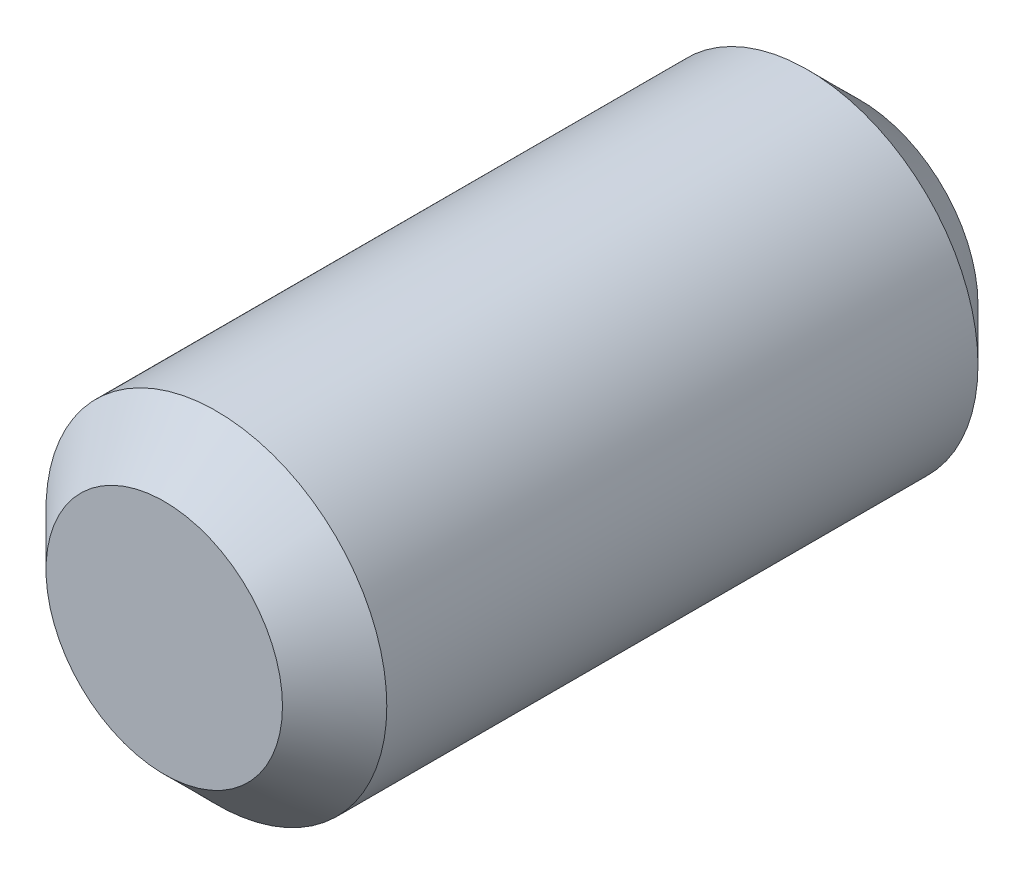
ISO-10303-21;
HEADER;
FILE_DESCRIPTION(('STEP AP214'),'2;1');
FILE_NAME('part.step','',(''),(''),'','','');
FILE_SCHEMA(('AUTOMOTIVE_DESIGN { 1 0 10303 214 1 1 1 1 }'));
ENDSEC;
DATA;
#1=APPLICATION_CONTEXT('core data for automotive mechanical design processes');
#2=APPLICATION_PROTOCOL_DEFINITION('international standard','automotive_design',2000,#1);
#3=PRODUCT_CONTEXT('',#1,'mechanical');
#4=PRODUCT('Part','Part','',(#3));
#5=PRODUCT_RELATED_PRODUCT_CATEGORY('part','',(#4));
#6=PRODUCT_DEFINITION_FORMATION('','',#4);
#7=PRODUCT_DEFINITION_CONTEXT('part definition',#1,'design');
#8=PRODUCT_DEFINITION('design','',#6,#7);
#9=PRODUCT_DEFINITION_SHAPE('','',#8);
#10=(LENGTH_UNIT() NAMED_UNIT(*) SI_UNIT(.MILLI.,.METRE.));
#11=(NAMED_UNIT(*) PLANE_ANGLE_UNIT() SI_UNIT($,.RADIAN.));
#12=(NAMED_UNIT(*) SI_UNIT($,.STERADIAN.) SOLID_ANGLE_UNIT());
#13=UNCERTAINTY_MEASURE_WITH_UNIT(LENGTH_MEASURE(1.E-05),#10,'distance_accuracy_value','');
#14=(GEOMETRIC_REPRESENTATION_CONTEXT(3) GLOBAL_UNCERTAINTY_ASSIGNED_CONTEXT((#13)) GLOBAL_UNIT_ASSIGNED_CONTEXT((#10,
#11,#12)) REPRESENTATION_CONTEXT('',''));
#15=CARTESIAN_POINT('',(0.,0.,0.));
#16=DIRECTION('',(0.,0.,1.));
#17=DIRECTION('',(1.,0.,0.));
#18=AXIS2_PLACEMENT_3D('',#15,#16,#17);
#19=CARTESIAN_POINT('',(0.,0.,10.));
#20=DIRECTION('',(0.,0.,-1.));
#21=DIRECTION('',(-1.,0.,0.));
#22=AXIS2_PLACEMENT_3D('',#19,#20,#21);
#23=CYLINDRICAL_SURFACE('',#22,2.45);
#24=CARTESIAN_POINT('',(0.,0.,9.25));
#25=DIRECTION('',(0.,0.,1.));
#26=DIRECTION('',(1.,0.,0.));
#27=AXIS2_PLACEMENT_3D('',#24,#25,#26);
#28=CIRCLE('',#27,2.45);
#29=CARTESIAN_POINT('',(2.45,0.,9.25));
#30=VERTEX_POINT('',#29);
#31=EDGE_CURVE('E51',#30,#30,#28,.F.);
#32=ORIENTED_EDGE('',*,*,#31,.T.);
#33=EDGE_LOOP('',(#32));
#34=FACE_BOUND('',#33,.T.);
#35=CARTESIAN_POINT('',(0.,0.,0.750000000000001));
#36=DIRECTION('',(0.,0.,1.));
#37=DIRECTION('',(1.,0.,0.));
#38=AXIS2_PLACEMENT_3D('',#35,#36,#37);
#39=CIRCLE('',#38,2.45);
#40=CARTESIAN_POINT('',(2.45,0.,0.750000000000001));
#41=VERTEX_POINT('',#40);
#42=EDGE_CURVE('E55',#41,#41,#39,.T.);
#43=ORIENTED_EDGE('',*,*,#42,.T.);
#44=EDGE_LOOP('',(#43));
#45=FACE_BOUND('',#44,.T.);
#46=ADVANCED_FACE('F43',(#34,#45),#23,.T.);
#47=CARTESIAN_POINT('',(0.,0.,10.));
#48=DIRECTION('',(0.,0.,1.));
#49=DIRECTION('',(1.,0.,0.));
#50=AXIS2_PLACEMENT_3D('',#47,#48,#49);
#51=PLANE('',#50);
#52=CARTESIAN_POINT('',(0.,0.,10.));
#53=DIRECTION('',(0.,0.,1.));
#54=DIRECTION('',(1.,0.,0.));
#55=AXIS2_PLACEMENT_3D('',#52,#53,#54);
#56=CIRCLE('',#55,1.7);
#57=CARTESIAN_POINT('',(1.7,0.,10.));
#58=VERTEX_POINT('',#57);
#59=EDGE_CURVE('E59',#58,#58,#56,.T.);
#60=ORIENTED_EDGE('',*,*,#59,.T.);
#61=EDGE_LOOP('',(#60));
#62=FACE_BOUND('',#61,.T.);
#63=ADVANCED_FACE('F65',(#62),#51,.T.);
#64=CARTESIAN_POINT('',(0.,0.,0.));
#65=DIRECTION('',(0.,0.,1.));
#66=DIRECTION('',(1.,0.,0.));
#67=AXIS2_PLACEMENT_3D('',#64,#65,#66);
#68=PLANE('',#67);
#69=CARTESIAN_POINT('',(0.,0.,0.));
#70=DIRECTION('',(0.,0.,1.));
#71=DIRECTION('',(1.,0.,0.));
#72=AXIS2_PLACEMENT_3D('',#69,#70,#71);
#73=CIRCLE('',#72,1.7);
#74=CARTESIAN_POINT('',(1.7,0.,0.));
#75=VERTEX_POINT('',#74);
#76=EDGE_CURVE('E12',#75,#75,#73,.F.);
#77=ORIENTED_EDGE('',*,*,#76,.T.);
#78=EDGE_LOOP('',(#77));
#79=FACE_BOUND('',#78,.T.);
#80=ADVANCED_FACE('F69',(#79),#68,.F.);
#81=CARTESIAN_POINT('',(0.,0.,10.));
#82=DIRECTION('',(0.,0.,-1.));
#83=DIRECTION('',(-1.,0.,0.));
#84=AXIS2_PLACEMENT_3D('',#81,#82,#83);
#85=CONICAL_SURFACE('',#84,1.7,0.785398163397448);
#86=ORIENTED_EDGE('',*,*,#31,.F.);
#87=EDGE_LOOP('',(#86));
#88=FACE_BOUND('',#87,.T.);
#89=ORIENTED_EDGE('',*,*,#59,.F.);
#90=EDGE_LOOP('',(#89));
#91=FACE_BOUND('',#90,.T.);
#92=ADVANCED_FACE('F67',(#88,#91),#85,.T.);
#93=CARTESIAN_POINT('',(0.,0.,0.750000000000001));
#94=DIRECTION('',(0.,0.,1.));
#95=DIRECTION('',(1.,0.,0.));
#96=AXIS2_PLACEMENT_3D('',#93,#94,#95);
#97=CONICAL_SURFACE('',#96,2.45,0.785398163397448);
#98=ORIENTED_EDGE('',*,*,#76,.F.);
#99=EDGE_LOOP('',(#98));
#100=FACE_BOUND('',#99,.T.);
#101=ORIENTED_EDGE('',*,*,#42,.F.);
#102=EDGE_LOOP('',(#101));
#103=FACE_BOUND('',#102,.T.);
#104=ADVANCED_FACE('F46',(#100,#103),#97,.T.);
#105=CLOSED_SHELL('',(#46,#63,#80,#92,#104));
#106=MANIFOLD_SOLID_BREP('B2',#105);
#107=ADVANCED_BREP_SHAPE_REPRESENTATION('',(#18,#106),#14);
#108=SHAPE_DEFINITION_REPRESENTATION(#9,#107);
ENDSEC;
END-ISO-10303-21;
